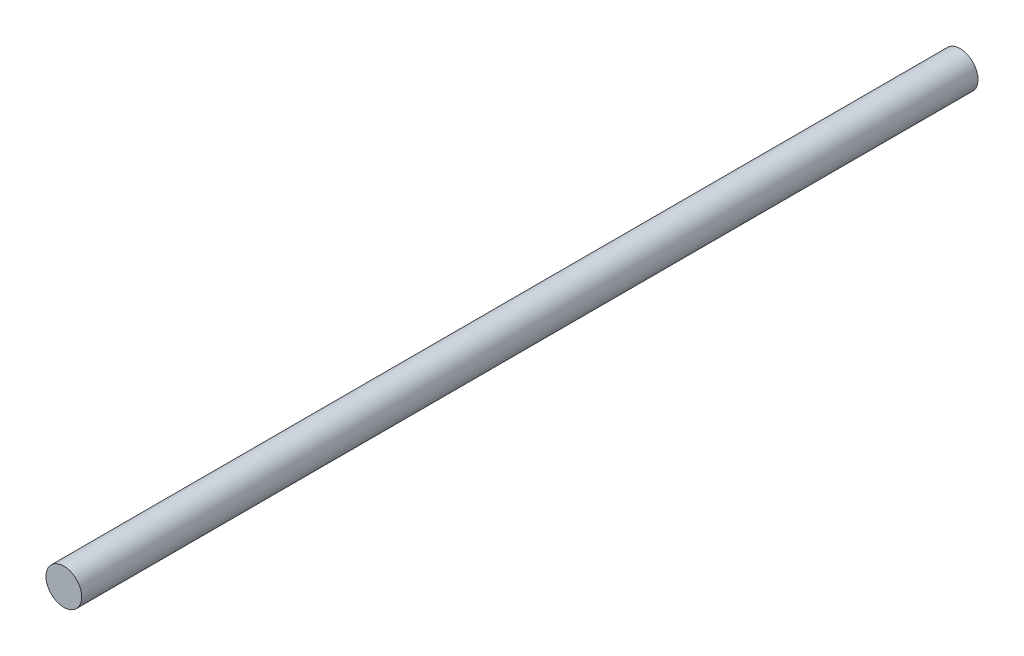
ISO-10303-21;
HEADER;
FILE_DESCRIPTION(('STEP AP214'),'2;1');
FILE_NAME('part.step','',(''),(''),'','','');
FILE_SCHEMA(('AUTOMOTIVE_DESIGN { 1 0 10303 214 1 1 1 1 }'));
ENDSEC;
DATA;
#1=APPLICATION_CONTEXT('core data for automotive mechanical design processes');
#2=APPLICATION_PROTOCOL_DEFINITION('international standard','automotive_design',2000,#1);
#3=PRODUCT_CONTEXT('',#1,'mechanical');
#4=PRODUCT('Part','Part','',(#3));
#5=PRODUCT_RELATED_PRODUCT_CATEGORY('part','',(#4));
#6=PRODUCT_DEFINITION_FORMATION('','',#4);
#7=PRODUCT_DEFINITION_CONTEXT('part definition',#1,'design');
#8=PRODUCT_DEFINITION('design','',#6,#7);
#9=PRODUCT_DEFINITION_SHAPE('','',#8);
#10=(LENGTH_UNIT() NAMED_UNIT(*) SI_UNIT(.MILLI.,.METRE.));
#11=(NAMED_UNIT(*) PLANE_ANGLE_UNIT() SI_UNIT($,.RADIAN.));
#12=(NAMED_UNIT(*) SI_UNIT($,.STERADIAN.) SOLID_ANGLE_UNIT());
#13=UNCERTAINTY_MEASURE_WITH_UNIT(LENGTH_MEASURE(1.E-05),#10,'distance_accuracy_value','');
#14=(GEOMETRIC_REPRESENTATION_CONTEXT(3) GLOBAL_UNCERTAINTY_ASSIGNED_CONTEXT((#13)) GLOBAL_UNIT_ASSIGNED_CONTEXT((#10,
#11,#12)) REPRESENTATION_CONTEXT('',''));
#15=CARTESIAN_POINT('',(0.,0.,0.));
#16=DIRECTION('',(0.,0.,1.));
#17=DIRECTION('',(1.,0.,0.));
#18=AXIS2_PLACEMENT_3D('',#15,#16,#17);
#19=CARTESIAN_POINT('',(0.,0.,75.24));
#20=DIRECTION('',(0.,0.,-1.));
#21=DIRECTION('',(-1.,0.,0.));
#22=AXIS2_PLACEMENT_3D('',#19,#20,#21);
#23=CYLINDRICAL_SURFACE('',#22,1.5);
#24=CARTESIAN_POINT('',(0.,0.,75.24));
#25=DIRECTION('',(0.,0.,1.));
#26=DIRECTION('',(1.,0.,0.));
#27=AXIS2_PLACEMENT_3D('',#24,#25,#26);
#28=CIRCLE('',#27,1.5);
#29=CARTESIAN_POINT('',(1.5,0.,75.24));
#30=VERTEX_POINT('',#29);
#31=EDGE_CURVE('E10',#30,#30,#28,.T.);
#32=ORIENTED_EDGE('',*,*,#31,.F.);
#33=EDGE_LOOP('',(#32));
#34=FACE_BOUND('',#33,.T.);
#35=CARTESIAN_POINT('',(0.,0.,0.));
#36=DIRECTION('',(0.,0.,1.));
#37=DIRECTION('',(1.,0.,0.));
#38=AXIS2_PLACEMENT_3D('',#35,#36,#37);
#39=CIRCLE('',#38,1.5);
#40=CARTESIAN_POINT('',(1.5,0.,0.));
#41=VERTEX_POINT('',#40);
#42=EDGE_CURVE('E34',#41,#41,#39,.T.);
#43=ORIENTED_EDGE('',*,*,#42,.T.);
#44=EDGE_LOOP('',(#43));
#45=FACE_BOUND('',#44,.T.);
#46=ADVANCED_FACE('F31',(#34,#45),#23,.T.);
#47=CARTESIAN_POINT('',(0.,0.,75.24));
#48=DIRECTION('',(0.,0.,1.));
#49=DIRECTION('',(1.,0.,0.));
#50=AXIS2_PLACEMENT_3D('',#47,#48,#49);
#51=PLANE('',#50);
#52=ORIENTED_EDGE('',*,*,#31,.T.);
#53=EDGE_LOOP('',(#52));
#54=FACE_BOUND('',#53,.T.);
#55=ADVANCED_FACE('F46',(#54),#51,.T.);
#56=CARTESIAN_POINT('',(0.,0.,0.));
#57=DIRECTION('',(0.,0.,1.));
#58=DIRECTION('',(1.,0.,0.));
#59=AXIS2_PLACEMENT_3D('',#56,#57,#58);
#60=PLANE('',#59);
#61=ORIENTED_EDGE('',*,*,#42,.F.);
#62=EDGE_LOOP('',(#61));
#63=FACE_BOUND('',#62,.T.);
#64=ADVANCED_FACE('F44',(#63),#60,.F.);
#65=CLOSED_SHELL('',(#46,#55,#64));
#66=MANIFOLD_SOLID_BREP('B2',#65);
#67=ADVANCED_BREP_SHAPE_REPRESENTATION('',(#18,#66),#14);
#68=SHAPE_DEFINITION_REPRESENTATION(#9,#67);
ENDSEC;
END-ISO-10303-21;
